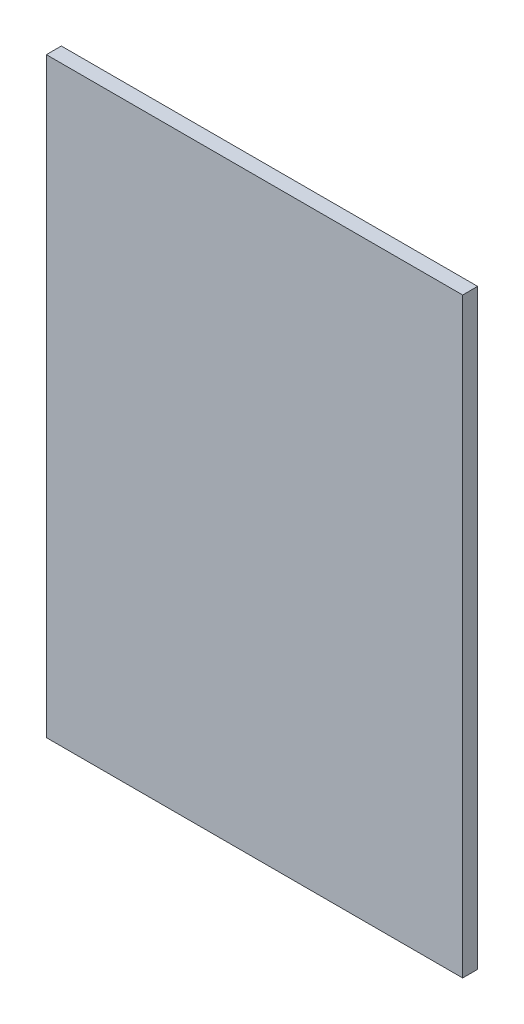
ISO-10303-21;
HEADER;
FILE_DESCRIPTION(('STEP AP214'),'2;1');
FILE_NAME('part.step','',(''),(''),'','','');
FILE_SCHEMA(('AUTOMOTIVE_DESIGN { 1 0 10303 214 1 1 1 1 }'));
ENDSEC;
DATA;
#1=APPLICATION_CONTEXT('core data for automotive mechanical design processes');
#2=APPLICATION_PROTOCOL_DEFINITION('international standard','automotive_design',2000,#1);
#3=PRODUCT_CONTEXT('',#1,'mechanical');
#4=PRODUCT('Part','Part','',(#3));
#5=PRODUCT_RELATED_PRODUCT_CATEGORY('part','',(#4));
#6=PRODUCT_DEFINITION_FORMATION('','',#4);
#7=PRODUCT_DEFINITION_CONTEXT('part definition',#1,'design');
#8=PRODUCT_DEFINITION('design','',#6,#7);
#9=PRODUCT_DEFINITION_SHAPE('','',#8);
#10=(LENGTH_UNIT() NAMED_UNIT(*) SI_UNIT(.MILLI.,.METRE.));
#11=(NAMED_UNIT(*) PLANE_ANGLE_UNIT() SI_UNIT($,.RADIAN.));
#12=(NAMED_UNIT(*) SI_UNIT($,.STERADIAN.) SOLID_ANGLE_UNIT());
#13=UNCERTAINTY_MEASURE_WITH_UNIT(LENGTH_MEASURE(1.E-05),#10,'distance_accuracy_value','');
#14=(GEOMETRIC_REPRESENTATION_CONTEXT(3) GLOBAL_UNCERTAINTY_ASSIGNED_CONTEXT((#13)) GLOBAL_UNIT_ASSIGNED_CONTEXT((#10,
#11,#12)) REPRESENTATION_CONTEXT('',''));
#15=CARTESIAN_POINT('',(0.,0.,0.));
#16=DIRECTION('',(0.,0.,1.));
#17=DIRECTION('',(1.,0.,0.));
#18=AXIS2_PLACEMENT_3D('',#15,#16,#17);
#19=CARTESIAN_POINT('',(69.5,-98.75,5.));
#20=DIRECTION('',(-1.,0.,0.));
#21=DIRECTION('',(0.,0.,1.));
#22=AXIS2_PLACEMENT_3D('',#19,#20,#21);
#23=PLANE('',#22);
#24=DIRECTION('',(0.,1.,0.));
#25=VECTOR('',#24,1.);
#26=CARTESIAN_POINT('',(69.5,-98.75,0.));
#27=LINE('',#26,#25);
#28=CARTESIAN_POINT('',(69.5,-98.75,0.));
#29=VERTEX_POINT('',#28);
#30=CARTESIAN_POINT('',(69.5,98.75,0.));
#31=VERTEX_POINT('',#30);
#32=EDGE_CURVE('E113',#29,#31,#27,.T.);
#33=ORIENTED_EDGE('',*,*,#32,.T.);
#34=DIRECTION('',(0.,0.,-1.));
#35=VECTOR('',#34,1.);
#36=CARTESIAN_POINT('',(69.5,98.75,5.));
#37=LINE('',#36,#35);
#38=CARTESIAN_POINT('',(69.5,98.75,5.));
#39=VERTEX_POINT('',#38);
#40=EDGE_CURVE('E11',#39,#31,#37,.T.);
#41=ORIENTED_EDGE('',*,*,#40,.F.);
#42=DIRECTION('',(0.,1.,0.));
#43=VECTOR('',#42,1.);
#44=CARTESIAN_POINT('',(69.5,-98.75,5.));
#45=LINE('',#44,#43);
#46=CARTESIAN_POINT('',(69.5,-98.75,5.));
#47=VERTEX_POINT('',#46);
#48=EDGE_CURVE('E97',#47,#39,#45,.T.);
#49=ORIENTED_EDGE('',*,*,#48,.F.);
#50=DIRECTION('',(0.,0.,-1.));
#51=VECTOR('',#50,1.);
#52=CARTESIAN_POINT('',(69.5,-98.75,5.));
#53=LINE('',#52,#51);
#54=EDGE_CURVE('E109',#47,#29,#53,.T.);
#55=ORIENTED_EDGE('',*,*,#54,.T.);
#56=EDGE_LOOP('',(#33,#41,#49,#55));
#57=FACE_BOUND('',#56,.T.);
#58=ADVANCED_FACE('F45',(#57),#23,.F.);
#59=CARTESIAN_POINT('',(-69.5,98.75,5.));
#60=DIRECTION('',(0.,-1.,0.));
#61=DIRECTION('',(0.,0.,-1.));
#62=AXIS2_PLACEMENT_3D('',#59,#60,#61);
#63=PLANE('',#62);
#64=DIRECTION('',(-1.,0.,0.));
#65=VECTOR('',#64,1.);
#66=CARTESIAN_POINT('',(-69.5,98.75,0.));
#67=LINE('',#66,#65);
#68=CARTESIAN_POINT('',(-69.5,98.75,0.));
#69=VERTEX_POINT('',#68);
#70=EDGE_CURVE('E102',#31,#69,#67,.T.);
#71=ORIENTED_EDGE('',*,*,#70,.T.);
#72=DIRECTION('',(0.,0.,-1.));
#73=VECTOR('',#72,1.);
#74=CARTESIAN_POINT('',(-69.5,98.75,5.));
#75=LINE('',#74,#73);
#76=CARTESIAN_POINT('',(-69.5,98.75,5.));
#77=VERTEX_POINT('',#76);
#78=EDGE_CURVE('E54',#77,#69,#75,.T.);
#79=ORIENTED_EDGE('',*,*,#78,.F.);
#80=DIRECTION('',(-1.,0.,0.));
#81=VECTOR('',#80,1.);
#82=CARTESIAN_POINT('',(-69.5,98.75,5.));
#83=LINE('',#82,#81);
#84=EDGE_CURVE('E92',#39,#77,#83,.T.);
#85=ORIENTED_EDGE('',*,*,#84,.F.);
#86=ORIENTED_EDGE('',*,*,#40,.T.);
#87=EDGE_LOOP('',(#71,#79,#85,#86));
#88=FACE_BOUND('',#87,.T.);
#89=ADVANCED_FACE('F101',(#88),#63,.F.);
#90=CARTESIAN_POINT('',(-69.5,-98.75,5.));
#91=DIRECTION('',(1.,0.,0.));
#92=DIRECTION('',(0.,0.,-1.));
#93=AXIS2_PLACEMENT_3D('',#90,#91,#92);
#94=PLANE('',#93);
#95=DIRECTION('',(0.,-1.,0.));
#96=VECTOR('',#95,1.);
#97=CARTESIAN_POINT('',(-69.5,-98.75,0.));
#98=LINE('',#97,#96);
#99=CARTESIAN_POINT('',(-69.5,-98.75,0.));
#100=VERTEX_POINT('',#99);
#101=EDGE_CURVE('E79',#69,#100,#98,.T.);
#102=ORIENTED_EDGE('',*,*,#101,.T.);
#103=DIRECTION('',(0.,0.,-1.));
#104=VECTOR('',#103,1.);
#105=CARTESIAN_POINT('',(-69.5,-98.75,5.));
#106=LINE('',#105,#104);
#107=CARTESIAN_POINT('',(-69.5,-98.75,5.));
#108=VERTEX_POINT('',#107);
#109=EDGE_CURVE('E104',#108,#100,#106,.T.);
#110=ORIENTED_EDGE('',*,*,#109,.F.);
#111=DIRECTION('',(0.,-1.,0.));
#112=VECTOR('',#111,1.);
#113=CARTESIAN_POINT('',(-69.5,-98.75,5.));
#114=LINE('',#113,#112);
#115=EDGE_CURVE('E95',#77,#108,#114,.T.);
#116=ORIENTED_EDGE('',*,*,#115,.F.);
#117=ORIENTED_EDGE('',*,*,#78,.T.);
#118=EDGE_LOOP('',(#102,#110,#116,#117));
#119=FACE_BOUND('',#118,.T.);
#120=ADVANCED_FACE('F105',(#119),#94,.F.);
#121=CARTESIAN_POINT('',(-69.5,-98.75,5.));
#122=DIRECTION('',(0.,1.,0.));
#123=DIRECTION('',(0.,0.,1.));
#124=AXIS2_PLACEMENT_3D('',#121,#122,#123);
#125=PLANE('',#124);
#126=DIRECTION('',(1.,0.,0.));
#127=VECTOR('',#126,1.);
#128=CARTESIAN_POINT('',(-69.5,-98.75,0.));
#129=LINE('',#128,#127);
#130=EDGE_CURVE('E85',#100,#29,#129,.T.);
#131=ORIENTED_EDGE('',*,*,#130,.T.);
#132=ORIENTED_EDGE('',*,*,#54,.F.);
#133=DIRECTION('',(1.,0.,0.));
#134=VECTOR('',#133,1.);
#135=CARTESIAN_POINT('',(-69.5,-98.75,5.));
#136=LINE('',#135,#134);
#137=EDGE_CURVE('E62',#108,#47,#136,.T.);
#138=ORIENTED_EDGE('',*,*,#137,.F.);
#139=ORIENTED_EDGE('',*,*,#109,.T.);
#140=EDGE_LOOP('',(#131,#132,#138,#139));
#141=FACE_BOUND('',#140,.T.);
#142=ADVANCED_FACE('F126',(#141),#125,.F.);
#143=CARTESIAN_POINT('',(0.,0.,5.));
#144=DIRECTION('',(0.,0.,-1.));
#145=DIRECTION('',(-1.,0.,0.));
#146=AXIS2_PLACEMENT_3D('',#143,#144,#145);
#147=PLANE('',#146);
#148=ORIENTED_EDGE('',*,*,#48,.T.);
#149=ORIENTED_EDGE('',*,*,#84,.T.);
#150=ORIENTED_EDGE('',*,*,#115,.T.);
#151=ORIENTED_EDGE('',*,*,#137,.T.);
#152=EDGE_LOOP('',(#148,#149,#150,#151));
#153=FACE_BOUND('',#152,.T.);
#154=ADVANCED_FACE('F93',(#153),#147,.F.);
#155=CARTESIAN_POINT('',(0.,0.,0.));
#156=DIRECTION('',(0.,0.,-1.));
#157=DIRECTION('',(-1.,0.,0.));
#158=AXIS2_PLACEMENT_3D('',#155,#156,#157);
#159=PLANE('',#158);
#160=ORIENTED_EDGE('',*,*,#32,.F.);
#161=ORIENTED_EDGE('',*,*,#130,.F.);
#162=ORIENTED_EDGE('',*,*,#101,.F.);
#163=ORIENTED_EDGE('',*,*,#70,.F.);
#164=EDGE_LOOP('',(#160,#161,#162,#163));
#165=FACE_BOUND('',#164,.T.);
#166=ADVANCED_FACE('F129',(#165),#159,.T.);
#167=CLOSED_SHELL('',(#58,#89,#120,#142,#154,#166));
#168=MANIFOLD_SOLID_BREP('B2',#167);
#169=ADVANCED_BREP_SHAPE_REPRESENTATION('',(#18,#168),#14);
#170=SHAPE_DEFINITION_REPRESENTATION(#9,#169);
ENDSEC;
END-ISO-10303-21;
